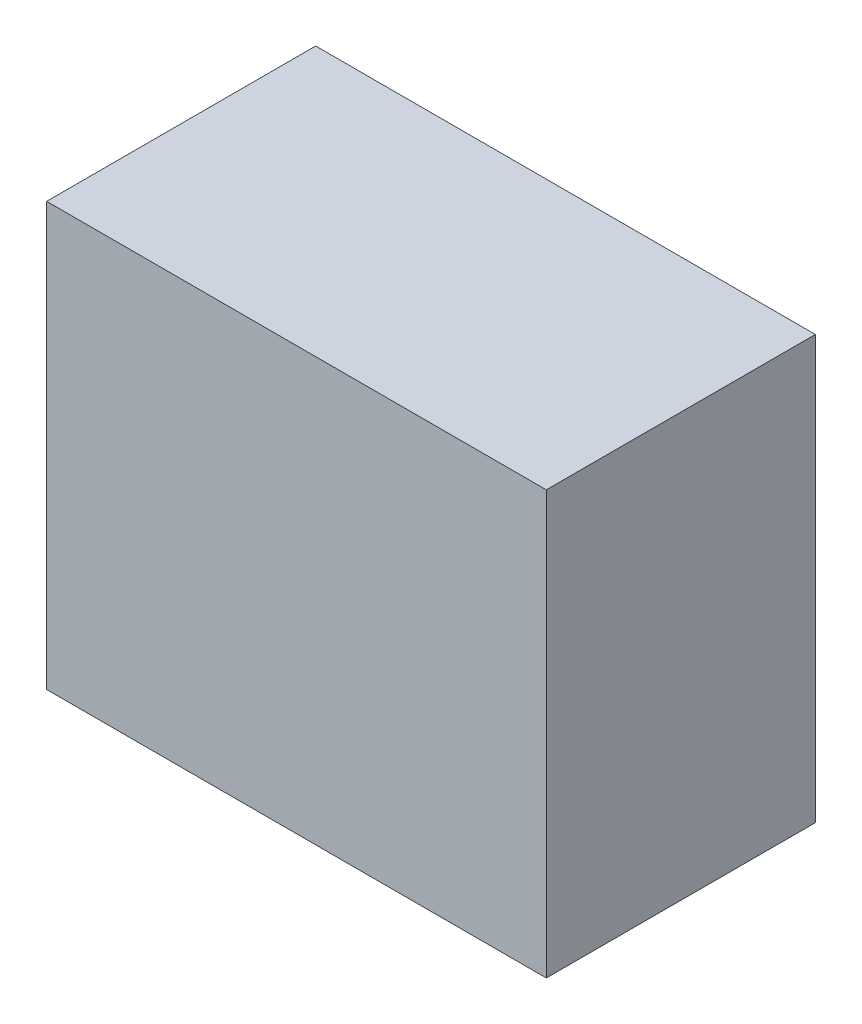
ISO-10303-21;
HEADER;
FILE_DESCRIPTION(('STEP AP214'),'2;1');
FILE_NAME('part.step','',(''),(''),'','','');
FILE_SCHEMA(('AUTOMOTIVE_DESIGN { 1 0 10303 214 1 1 1 1 }'));
ENDSEC;
DATA;
#1=APPLICATION_CONTEXT('core data for automotive mechanical design processes');
#2=APPLICATION_PROTOCOL_DEFINITION('international standard','automotive_design',2000,#1);
#3=PRODUCT_CONTEXT('',#1,'mechanical');
#4=PRODUCT('Part','Part','',(#3));
#5=PRODUCT_RELATED_PRODUCT_CATEGORY('part','',(#4));
#6=PRODUCT_DEFINITION_FORMATION('','',#4);
#7=PRODUCT_DEFINITION_CONTEXT('part definition',#1,'design');
#8=PRODUCT_DEFINITION('design','',#6,#7);
#9=PRODUCT_DEFINITION_SHAPE('','',#8);
#10=(LENGTH_UNIT() NAMED_UNIT(*) SI_UNIT(.MILLI.,.METRE.));
#11=(NAMED_UNIT(*) PLANE_ANGLE_UNIT() SI_UNIT($,.RADIAN.));
#12=(NAMED_UNIT(*) SI_UNIT($,.STERADIAN.) SOLID_ANGLE_UNIT());
#13=UNCERTAINTY_MEASURE_WITH_UNIT(LENGTH_MEASURE(1.E-05),#10,'distance_accuracy_value','');
#14=(GEOMETRIC_REPRESENTATION_CONTEXT(3) GLOBAL_UNCERTAINTY_ASSIGNED_CONTEXT((#13)) GLOBAL_UNIT_ASSIGNED_CONTEXT((#10,
#11,#12)) REPRESENTATION_CONTEXT('',''));
#15=CARTESIAN_POINT('',(0.,0.,0.));
#16=DIRECTION('',(0.,0.,1.));
#17=DIRECTION('',(1.,0.,0.));
#18=AXIS2_PLACEMENT_3D('',#15,#16,#17);
#19=CARTESIAN_POINT('',(32.5,-27.5,35.));
#20=DIRECTION('',(-1.,0.,0.));
#21=DIRECTION('',(0.,0.,1.));
#22=AXIS2_PLACEMENT_3D('',#19,#20,#21);
#23=PLANE('',#22);
#24=DIRECTION('',(0.,1.,0.));
#25=VECTOR('',#24,1.);
#26=CARTESIAN_POINT('',(32.5,-27.5,0.));
#27=LINE('',#26,#25);
#28=CARTESIAN_POINT('',(32.5,-27.5,0.));
#29=VERTEX_POINT('',#28);
#30=CARTESIAN_POINT('',(32.5,27.5,0.));
#31=VERTEX_POINT('',#30);
#32=EDGE_CURVE('E141',#29,#31,#27,.T.);
#33=ORIENTED_EDGE('',*,*,#32,.T.);
#34=DIRECTION('',(0.,0.,-1.));
#35=VECTOR('',#34,1.);
#36=CARTESIAN_POINT('',(32.5,27.5,35.));
#37=LINE('',#36,#35);
#38=CARTESIAN_POINT('',(32.5,27.5,35.));
#39=VERTEX_POINT('',#38);
#40=EDGE_CURVE('E11',#39,#31,#37,.T.);
#41=ORIENTED_EDGE('',*,*,#40,.F.);
#42=DIRECTION('',(0.,1.,0.));
#43=VECTOR('',#42,1.);
#44=CARTESIAN_POINT('',(32.5,-27.5,35.));
#45=LINE('',#44,#43);
#46=CARTESIAN_POINT('',(32.5,-27.5,35.));
#47=VERTEX_POINT('',#46);
#48=EDGE_CURVE('E145',#47,#39,#45,.T.);
#49=ORIENTED_EDGE('',*,*,#48,.F.);
#50=DIRECTION('',(0.,0.,-1.));
#51=VECTOR('',#50,1.);
#52=CARTESIAN_POINT('',(32.5,-27.5,35.));
#53=LINE('',#52,#51);
#54=EDGE_CURVE('E151',#47,#29,#53,.T.);
#55=ORIENTED_EDGE('',*,*,#54,.T.);
#56=EDGE_LOOP('',(#33,#41,#49,#55));
#57=FACE_BOUND('',#56,.T.);
#58=ADVANCED_FACE('F33',(#57),#23,.F.);
#59=CARTESIAN_POINT('',(-32.5,27.5,35.));
#60=DIRECTION('',(0.,-1.,0.));
#61=DIRECTION('',(0.,0.,-1.));
#62=AXIS2_PLACEMENT_3D('',#59,#60,#61);
#63=PLANE('',#62);
#64=DIRECTION('',(-1.,0.,0.));
#65=VECTOR('',#64,1.);
#66=CARTESIAN_POINT('',(-32.5,27.5,0.));
#67=LINE('',#66,#65);
#68=CARTESIAN_POINT('',(-32.5,27.5,0.));
#69=VERTEX_POINT('',#68);
#70=EDGE_CURVE('E154',#31,#69,#67,.T.);
#71=ORIENTED_EDGE('',*,*,#70,.T.);
#72=DIRECTION('',(0.,0.,-1.));
#73=VECTOR('',#72,1.);
#74=CARTESIAN_POINT('',(-32.5,27.5,35.));
#75=LINE('',#74,#73);
#76=CARTESIAN_POINT('',(-32.5,27.5,35.));
#77=VERTEX_POINT('',#76);
#78=EDGE_CURVE('E40',#77,#69,#75,.T.);
#79=ORIENTED_EDGE('',*,*,#78,.F.);
#80=DIRECTION('',(-1.,0.,0.));
#81=VECTOR('',#80,1.);
#82=CARTESIAN_POINT('',(-32.5,27.5,35.));
#83=LINE('',#82,#81);
#84=EDGE_CURVE('E84',#39,#77,#83,.T.);
#85=ORIENTED_EDGE('',*,*,#84,.F.);
#86=ORIENTED_EDGE('',*,*,#40,.T.);
#87=EDGE_LOOP('',(#71,#79,#85,#86));
#88=FACE_BOUND('',#87,.T.);
#89=ADVANCED_FACE('F182',(#88),#63,.F.);
#90=CARTESIAN_POINT('',(-32.5,-27.5,35.));
#91=DIRECTION('',(1.,0.,0.));
#92=DIRECTION('',(0.,0.,-1.));
#93=AXIS2_PLACEMENT_3D('',#90,#91,#92);
#94=PLANE('',#93);
#95=DIRECTION('',(0.,0.,-1.));
#96=VECTOR('',#95,1.);
#97=CARTESIAN_POINT('',(-32.5,25.5,33.));
#98=LINE('',#97,#96);
#99=CARTESIAN_POINT('',(-32.5,25.5,33.));
#100=VERTEX_POINT('',#99);
#101=CARTESIAN_POINT('',(-32.5,25.5,2.));
#102=VERTEX_POINT('',#101);
#103=EDGE_CURVE('E135',#100,#102,#98,.T.);
#104=ORIENTED_EDGE('',*,*,#103,.F.);
#105=DIRECTION('',(0.,1.,0.));
#106=VECTOR('',#105,1.);
#107=CARTESIAN_POINT('',(-32.5,-25.5,33.));
#108=LINE('',#107,#106);
#109=CARTESIAN_POINT('',(-32.5,-25.5,33.));
#110=VERTEX_POINT('',#109);
#111=EDGE_CURVE('E47',#110,#100,#108,.T.);
#112=ORIENTED_EDGE('',*,*,#111,.F.);
#113=DIRECTION('',(0.,0.,1.));
#114=VECTOR('',#113,1.);
#115=CARTESIAN_POINT('',(-32.5,-25.5,33.));
#116=LINE('',#115,#114);
#117=CARTESIAN_POINT('',(-32.5,-25.5,2.));
#118=VERTEX_POINT('',#117);
#119=EDGE_CURVE('E126',#118,#110,#116,.T.);
#120=ORIENTED_EDGE('',*,*,#119,.F.);
#121=DIRECTION('',(0.,-1.,0.));
#122=VECTOR('',#121,1.);
#123=CARTESIAN_POINT('',(-32.5,-25.5,2.));
#124=LINE('',#123,#122);
#125=EDGE_CURVE('E129',#102,#118,#124,.T.);
#126=ORIENTED_EDGE('',*,*,#125,.F.);
#127=EDGE_LOOP('',(#104,#112,#120,#126));
#128=FACE_BOUND('',#127,.T.);
#129=DIRECTION('',(0.,-1.,0.));
#130=VECTOR('',#129,1.);
#131=CARTESIAN_POINT('',(-32.5,-27.5,0.));
#132=LINE('',#131,#130);
#133=CARTESIAN_POINT('',(-32.5,-27.5,0.));
#134=VERTEX_POINT('',#133);
#135=EDGE_CURVE('E156',#69,#134,#132,.T.);
#136=ORIENTED_EDGE('',*,*,#135,.T.);
#137=DIRECTION('',(0.,0.,-1.));
#138=VECTOR('',#137,1.);
#139=CARTESIAN_POINT('',(-32.5,-27.5,35.));
#140=LINE('',#139,#138);
#141=CARTESIAN_POINT('',(-32.5,-27.5,35.));
#142=VERTEX_POINT('',#141);
#143=EDGE_CURVE('E160',#142,#134,#140,.T.);
#144=ORIENTED_EDGE('',*,*,#143,.F.);
#145=DIRECTION('',(0.,-1.,0.));
#146=VECTOR('',#145,1.);
#147=CARTESIAN_POINT('',(-32.5,-27.5,35.));
#148=LINE('',#147,#146);
#149=EDGE_CURVE('E148',#77,#142,#148,.T.);
#150=ORIENTED_EDGE('',*,*,#149,.F.);
#151=ORIENTED_EDGE('',*,*,#78,.T.);
#152=EDGE_LOOP('',(#136,#144,#150,#151));
#153=FACE_BOUND('',#152,.T.);
#154=ADVANCED_FACE('F165',(#128,#153),#94,.F.);
#155=CARTESIAN_POINT('',(-32.5,-27.5,35.));
#156=DIRECTION('',(0.,1.,0.));
#157=DIRECTION('',(0.,0.,1.));
#158=AXIS2_PLACEMENT_3D('',#155,#156,#157);
#159=PLANE('',#158);
#160=DIRECTION('',(1.,0.,0.));
#161=VECTOR('',#160,1.);
#162=CARTESIAN_POINT('',(-32.5,-27.5,0.));
#163=LINE('',#162,#161);
#164=EDGE_CURVE('E77',#134,#29,#163,.T.);
#165=ORIENTED_EDGE('',*,*,#164,.T.);
#166=ORIENTED_EDGE('',*,*,#54,.F.);
#167=DIRECTION('',(1.,0.,0.));
#168=VECTOR('',#167,1.);
#169=CARTESIAN_POINT('',(-32.5,-27.5,35.));
#170=LINE('',#169,#168);
#171=EDGE_CURVE('E56',#142,#47,#170,.T.);
#172=ORIENTED_EDGE('',*,*,#171,.F.);
#173=ORIENTED_EDGE('',*,*,#143,.T.);
#174=EDGE_LOOP('',(#165,#166,#172,#173));
#175=FACE_BOUND('',#174,.T.);
#176=ADVANCED_FACE('F173',(#175),#159,.F.);
#177=CARTESIAN_POINT('',(0.,0.,35.));
#178=DIRECTION('',(0.,0.,-1.));
#179=DIRECTION('',(-1.,0.,0.));
#180=AXIS2_PLACEMENT_3D('',#177,#178,#179);
#181=PLANE('',#180);
#182=ORIENTED_EDGE('',*,*,#48,.T.);
#183=ORIENTED_EDGE('',*,*,#84,.T.);
#184=ORIENTED_EDGE('',*,*,#149,.T.);
#185=ORIENTED_EDGE('',*,*,#171,.T.);
#186=EDGE_LOOP('',(#182,#183,#184,#185));
#187=FACE_BOUND('',#186,.T.);
#188=ADVANCED_FACE('F175',(#187),#181,.F.);
#189=CARTESIAN_POINT('',(0.,0.,0.));
#190=DIRECTION('',(0.,0.,-1.));
#191=DIRECTION('',(-1.,0.,0.));
#192=AXIS2_PLACEMENT_3D('',#189,#190,#191);
#193=PLANE('',#192);
#194=ORIENTED_EDGE('',*,*,#32,.F.);
#195=ORIENTED_EDGE('',*,*,#164,.F.);
#196=ORIENTED_EDGE('',*,*,#135,.F.);
#197=ORIENTED_EDGE('',*,*,#70,.F.);
#198=EDGE_LOOP('',(#194,#195,#196,#197));
#199=FACE_BOUND('',#198,.T.);
#200=ADVANCED_FACE('F169',(#199),#193,.T.);
#201=CARTESIAN_POINT('',(27.5,-25.5,33.));
#202=DIRECTION('',(0.,0.,1.));
#203=DIRECTION('',(1.,0.,0.));
#204=AXIS2_PLACEMENT_3D('',#201,#202,#203);
#205=PLANE('',#204);
#206=ORIENTED_EDGE('',*,*,#111,.T.);
#207=DIRECTION('',(-1.,0.,0.));
#208=VECTOR('',#207,1.);
#209=CARTESIAN_POINT('',(27.5,25.5,33.));
#210=LINE('',#209,#208);
#211=CARTESIAN_POINT('',(27.5,25.5,33.));
#212=VERTEX_POINT('',#211);
#213=EDGE_CURVE('E104',#212,#100,#210,.T.);
#214=ORIENTED_EDGE('',*,*,#213,.F.);
#215=DIRECTION('',(0.,1.,0.));
#216=VECTOR('',#215,1.);
#217=CARTESIAN_POINT('',(27.5,-25.5,33.));
#218=LINE('',#217,#216);
#219=CARTESIAN_POINT('',(27.5,-25.5,33.));
#220=VERTEX_POINT('',#219);
#221=EDGE_CURVE('E108',#220,#212,#218,.T.);
#222=ORIENTED_EDGE('',*,*,#221,.F.);
#223=DIRECTION('',(-1.,0.,0.));
#224=VECTOR('',#223,1.);
#225=CARTESIAN_POINT('',(27.5,-25.5,33.));
#226=LINE('',#225,#224);
#227=EDGE_CURVE('E139',#220,#110,#226,.T.);
#228=ORIENTED_EDGE('',*,*,#227,.T.);
#229=EDGE_LOOP('',(#206,#214,#222,#228));
#230=FACE_BOUND('',#229,.T.);
#231=ADVANCED_FACE('F106',(#230),#205,.F.);
#232=CARTESIAN_POINT('',(27.5,-25.5,33.));
#233=DIRECTION('',(0.,-1.,0.));
#234=DIRECTION('',(0.,0.,-1.));
#235=AXIS2_PLACEMENT_3D('',#232,#233,#234);
#236=PLANE('',#235);
#237=ORIENTED_EDGE('',*,*,#119,.T.);
#238=ORIENTED_EDGE('',*,*,#227,.F.);
#239=DIRECTION('',(0.,0.,1.));
#240=VECTOR('',#239,1.);
#241=CARTESIAN_POINT('',(27.5,-25.5,33.));
#242=LINE('',#241,#240);
#243=CARTESIAN_POINT('',(27.5,-25.5,2.));
#244=VERTEX_POINT('',#243);
#245=EDGE_CURVE('E114',#244,#220,#242,.T.);
#246=ORIENTED_EDGE('',*,*,#245,.F.);
#247=DIRECTION('',(-1.,0.,0.));
#248=VECTOR('',#247,1.);
#249=CARTESIAN_POINT('',(27.5,-25.5,2.));
#250=LINE('',#249,#248);
#251=EDGE_CURVE('E142',#244,#118,#250,.T.);
#252=ORIENTED_EDGE('',*,*,#251,.T.);
#253=EDGE_LOOP('',(#237,#238,#246,#252));
#254=FACE_BOUND('',#253,.T.);
#255=ADVANCED_FACE('F211',(#254),#236,.F.);
#256=CARTESIAN_POINT('',(27.5,-25.5,2.));
#257=DIRECTION('',(0.,0.,-1.));
#258=DIRECTION('',(-1.,0.,0.));
#259=AXIS2_PLACEMENT_3D('',#256,#257,#258);
#260=PLANE('',#259);
#261=ORIENTED_EDGE('',*,*,#125,.T.);
#262=ORIENTED_EDGE('',*,*,#251,.F.);
#263=DIRECTION('',(0.,-1.,0.));
#264=VECTOR('',#263,1.);
#265=CARTESIAN_POINT('',(27.5,-25.5,2.));
#266=LINE('',#265,#264);
#267=CARTESIAN_POINT('',(27.5,25.5,2.));
#268=VERTEX_POINT('',#267);
#269=EDGE_CURVE('E122',#268,#244,#266,.T.);
#270=ORIENTED_EDGE('',*,*,#269,.F.);
#271=DIRECTION('',(-1.,0.,0.));
#272=VECTOR('',#271,1.);
#273=CARTESIAN_POINT('',(27.5,25.5,2.));
#274=LINE('',#273,#272);
#275=EDGE_CURVE('E113',#268,#102,#274,.T.);
#276=ORIENTED_EDGE('',*,*,#275,.T.);
#277=EDGE_LOOP('',(#261,#262,#270,#276));
#278=FACE_BOUND('',#277,.T.);
#279=ADVANCED_FACE('F220',(#278),#260,.F.);
#280=CARTESIAN_POINT('',(27.5,25.5,33.));
#281=DIRECTION('',(0.,1.,0.));
#282=DIRECTION('',(0.,0.,1.));
#283=AXIS2_PLACEMENT_3D('',#280,#281,#282);
#284=PLANE('',#283);
#285=ORIENTED_EDGE('',*,*,#103,.T.);
#286=ORIENTED_EDGE('',*,*,#275,.F.);
#287=DIRECTION('',(0.,0.,-1.));
#288=VECTOR('',#287,1.);
#289=CARTESIAN_POINT('',(27.5,25.5,33.));
#290=LINE('',#289,#288);
#291=EDGE_CURVE('E117',#212,#268,#290,.T.);
#292=ORIENTED_EDGE('',*,*,#291,.F.);
#293=ORIENTED_EDGE('',*,*,#213,.T.);
#294=EDGE_LOOP('',(#285,#286,#292,#293));
#295=FACE_BOUND('',#294,.T.);
#296=ADVANCED_FACE('F118',(#295),#284,.F.);
#297=CARTESIAN_POINT('',(27.5,0.,0.));
#298=DIRECTION('',(-1.,0.,0.));
#299=DIRECTION('',(0.,0.,1.));
#300=AXIS2_PLACEMENT_3D('',#297,#298,#299);
#301=PLANE('',#300);
#302=ORIENTED_EDGE('',*,*,#221,.T.);
#303=ORIENTED_EDGE('',*,*,#291,.T.);
#304=ORIENTED_EDGE('',*,*,#269,.T.);
#305=ORIENTED_EDGE('',*,*,#245,.T.);
#306=EDGE_LOOP('',(#302,#303,#304,#305));
#307=FACE_BOUND('',#306,.T.);
#308=ADVANCED_FACE('F124',(#307),#301,.T.);
#309=CLOSED_SHELL('',(#58,#89,#154,#176,#188,#200,#231,#255,#279,#296,#308));
#310=MANIFOLD_SOLID_BREP('B2',#309);
#311=ADVANCED_BREP_SHAPE_REPRESENTATION('',(#18,#310),#14);
#312=SHAPE_DEFINITION_REPRESENTATION(#9,#311);
ENDSEC;
END-ISO-10303-21;
